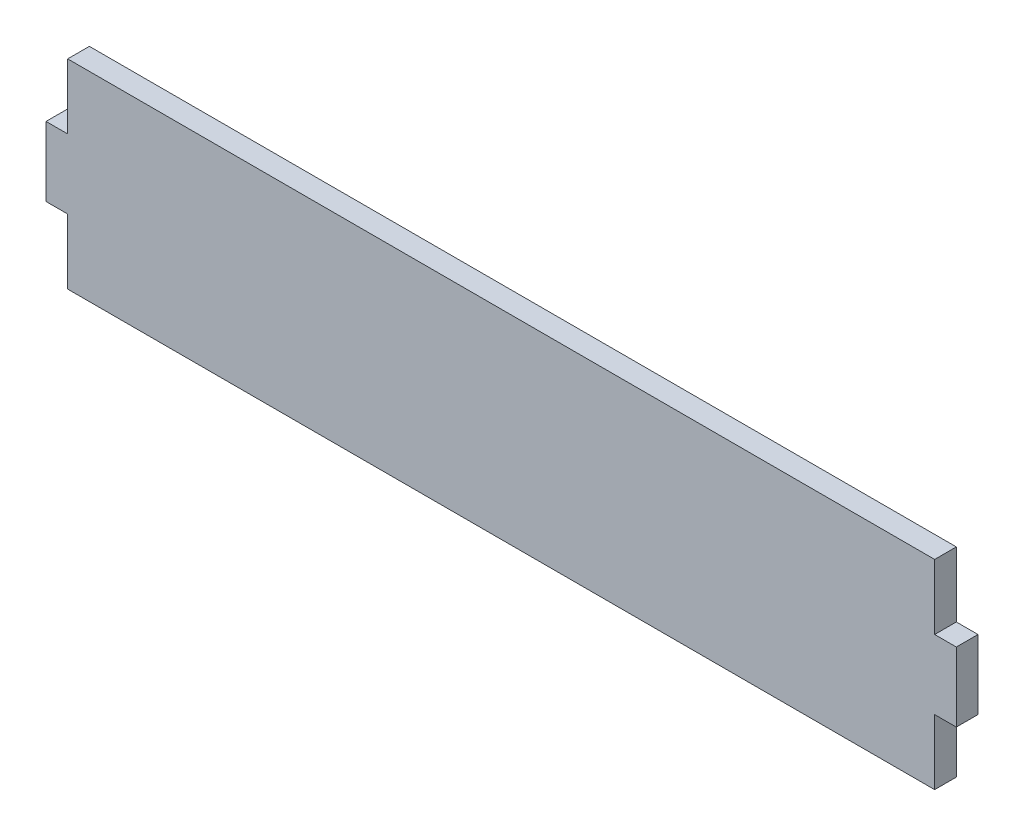
ISO-10303-21;
HEADER;
FILE_DESCRIPTION(('STEP AP214'),'2;1');
FILE_NAME('part.step','',(''),(''),'','','');
FILE_SCHEMA(('AUTOMOTIVE_DESIGN { 1 0 10303 214 1 1 1 1 }'));
ENDSEC;
DATA;
#1=APPLICATION_CONTEXT('core data for automotive mechanical design processes');
#2=APPLICATION_PROTOCOL_DEFINITION('international standard','automotive_design',2000,#1);
#3=PRODUCT_CONTEXT('',#1,'mechanical');
#4=PRODUCT('Part','Part','',(#3));
#5=PRODUCT_RELATED_PRODUCT_CATEGORY('part','',(#4));
#6=PRODUCT_DEFINITION_FORMATION('','',#4);
#7=PRODUCT_DEFINITION_CONTEXT('part definition',#1,'design');
#8=PRODUCT_DEFINITION('design','',#6,#7);
#9=PRODUCT_DEFINITION_SHAPE('','',#8);
#10=(LENGTH_UNIT() NAMED_UNIT(*) SI_UNIT(.MILLI.,.METRE.));
#11=(NAMED_UNIT(*) PLANE_ANGLE_UNIT() SI_UNIT($,.RADIAN.));
#12=(NAMED_UNIT(*) SI_UNIT($,.STERADIAN.) SOLID_ANGLE_UNIT());
#13=UNCERTAINTY_MEASURE_WITH_UNIT(LENGTH_MEASURE(1.E-05),#10,'distance_accuracy_value','');
#14=(GEOMETRIC_REPRESENTATION_CONTEXT(3) GLOBAL_UNCERTAINTY_ASSIGNED_CONTEXT((#13)) GLOBAL_UNIT_ASSIGNED_CONTEXT((#10,
#11,#12)) REPRESENTATION_CONTEXT('',''));
#15=CARTESIAN_POINT('',(0.,0.,0.));
#16=DIRECTION('',(0.,0.,1.));
#17=DIRECTION('',(1.,0.,0.));
#18=AXIS2_PLACEMENT_3D('',#15,#16,#17);
#19=CARTESIAN_POINT('',(52.5,-4.,2.5));
#20=DIRECTION('',(-1.,0.,0.));
#21=DIRECTION('',(0.,0.,1.));
#22=AXIS2_PLACEMENT_3D('',#19,#20,#21);
#23=PLANE('',#22);
#24=DIRECTION('',(0.,1.,0.));
#25=VECTOR('',#24,1.);
#26=CARTESIAN_POINT('',(52.5,-4.,0.));
#27=LINE('',#26,#25);
#28=CARTESIAN_POINT('',(52.5,-4.,0.));
#29=VERTEX_POINT('',#28);
#30=CARTESIAN_POINT('',(52.5,4.,0.));
#31=VERTEX_POINT('',#30);
#32=EDGE_CURVE('E155',#29,#31,#27,.T.);
#33=ORIENTED_EDGE('',*,*,#32,.T.);
#34=DIRECTION('',(0.,0.,-1.));
#35=VECTOR('',#34,1.);
#36=CARTESIAN_POINT('',(52.5,4.,2.5));
#37=LINE('',#36,#35);
#38=CARTESIAN_POINT('',(52.5,4.,2.5));
#39=VERTEX_POINT('',#38);
#40=EDGE_CURVE('E11',#39,#31,#37,.T.);
#41=ORIENTED_EDGE('',*,*,#40,.F.);
#42=DIRECTION('',(0.,1.,0.));
#43=VECTOR('',#42,1.);
#44=CARTESIAN_POINT('',(52.5,-4.,2.5));
#45=LINE('',#44,#43);
#46=CARTESIAN_POINT('',(52.5,-4.,2.5));
#47=VERTEX_POINT('',#46);
#48=EDGE_CURVE('E177',#47,#39,#45,.T.);
#49=ORIENTED_EDGE('',*,*,#48,.F.);
#50=DIRECTION('',(0.,0.,-1.));
#51=VECTOR('',#50,1.);
#52=CARTESIAN_POINT('',(52.5,-4.,2.5));
#53=LINE('',#52,#51);
#54=EDGE_CURVE('E151',#47,#29,#53,.T.);
#55=ORIENTED_EDGE('',*,*,#54,.T.);
#56=EDGE_LOOP('',(#33,#41,#49,#55));
#57=FACE_BOUND('',#56,.T.);
#58=ADVANCED_FACE('F35',(#57),#23,.F.);
#59=CARTESIAN_POINT('',(50.,4.,2.5));
#60=DIRECTION('',(0.,-1.,0.));
#61=DIRECTION('',(0.,0.,-1.));
#62=AXIS2_PLACEMENT_3D('',#59,#60,#61);
#63=PLANE('',#62);
#64=DIRECTION('',(-1.,0.,0.));
#65=VECTOR('',#64,1.);
#66=CARTESIAN_POINT('',(50.,4.,0.));
#67=LINE('',#66,#65);
#68=CARTESIAN_POINT('',(50.,4.,0.));
#69=VERTEX_POINT('',#68);
#70=EDGE_CURVE('E158',#31,#69,#67,.T.);
#71=ORIENTED_EDGE('',*,*,#70,.T.);
#72=DIRECTION('',(0.,0.,-1.));
#73=VECTOR('',#72,1.);
#74=CARTESIAN_POINT('',(50.,4.,2.5));
#75=LINE('',#74,#73);
#76=CARTESIAN_POINT('',(50.,4.,2.5));
#77=VERTEX_POINT('',#76);
#78=EDGE_CURVE('E43',#77,#69,#75,.T.);
#79=ORIENTED_EDGE('',*,*,#78,.F.);
#80=DIRECTION('',(-1.,0.,0.));
#81=VECTOR('',#80,1.);
#82=CARTESIAN_POINT('',(50.,4.,2.5));
#83=LINE('',#82,#81);
#84=EDGE_CURVE('E106',#39,#77,#83,.T.);
#85=ORIENTED_EDGE('',*,*,#84,.F.);
#86=ORIENTED_EDGE('',*,*,#40,.T.);
#87=EDGE_LOOP('',(#71,#79,#85,#86));
#88=FACE_BOUND('',#87,.T.);
#89=ADVANCED_FACE('F255',(#88),#63,.F.);
#90=CARTESIAN_POINT('',(50.,11.5,2.5));
#91=DIRECTION('',(-1.,0.,0.));
#92=DIRECTION('',(0.,0.,1.));
#93=AXIS2_PLACEMENT_3D('',#90,#91,#92);
#94=PLANE('',#93);
#95=DIRECTION('',(0.,1.,0.));
#96=VECTOR('',#95,1.);
#97=CARTESIAN_POINT('',(50.,11.5,0.));
#98=LINE('',#97,#96);
#99=CARTESIAN_POINT('',(50.,11.5,0.));
#100=VERTEX_POINT('',#99);
#101=EDGE_CURVE('E160',#69,#100,#98,.T.);
#102=ORIENTED_EDGE('',*,*,#101,.T.);
#103=DIRECTION('',(0.,0.,-1.));
#104=VECTOR('',#103,1.);
#105=CARTESIAN_POINT('',(50.,11.5,2.5));
#106=LINE('',#105,#104);
#107=CARTESIAN_POINT('',(50.,11.5,2.5));
#108=VERTEX_POINT('',#107);
#109=EDGE_CURVE('E196',#108,#100,#106,.T.);
#110=ORIENTED_EDGE('',*,*,#109,.F.);
#111=DIRECTION('',(0.,1.,0.));
#112=VECTOR('',#111,1.);
#113=CARTESIAN_POINT('',(50.,11.5,2.5));
#114=LINE('',#113,#112);
#115=EDGE_CURVE('E204',#77,#108,#114,.T.);
#116=ORIENTED_EDGE('',*,*,#115,.F.);
#117=ORIENTED_EDGE('',*,*,#78,.T.);
#118=EDGE_LOOP('',(#102,#110,#116,#117));
#119=FACE_BOUND('',#118,.T.);
#120=ADVANCED_FACE('F202',(#119),#94,.F.);
#121=CARTESIAN_POINT('',(-50.,11.5,2.5));
#122=DIRECTION('',(0.,-1.,0.));
#123=DIRECTION('',(1.,0.,0.));
#124=AXIS2_PLACEMENT_3D('',#121,#122,#123);
#125=PLANE('',#124);
#126=DIRECTION('',(-1.,0.,0.));
#127=VECTOR('',#126,1.);
#128=CARTESIAN_POINT('',(-50.,11.5,0.));
#129=LINE('',#128,#127);
#130=CARTESIAN_POINT('',(-50.,11.5,0.));
#131=VERTEX_POINT('',#130);
#132=EDGE_CURVE('E162',#100,#131,#129,.T.);
#133=ORIENTED_EDGE('',*,*,#132,.T.);
#134=DIRECTION('',(0.,0.,-1.));
#135=VECTOR('',#134,1.);
#136=CARTESIAN_POINT('',(-50.,11.5,2.5));
#137=LINE('',#136,#135);
#138=CARTESIAN_POINT('',(-50.,11.5,2.5));
#139=VERTEX_POINT('',#138);
#140=EDGE_CURVE('E193',#139,#131,#137,.T.);
#141=ORIENTED_EDGE('',*,*,#140,.F.);
#142=DIRECTION('',(-1.,0.,0.));
#143=VECTOR('',#142,1.);
#144=CARTESIAN_POINT('',(-50.,11.5,2.5));
#145=LINE('',#144,#143);
#146=EDGE_CURVE('E222',#108,#139,#145,.T.);
#147=ORIENTED_EDGE('',*,*,#146,.F.);
#148=ORIENTED_EDGE('',*,*,#109,.T.);
#149=EDGE_LOOP('',(#133,#141,#147,#148));
#150=FACE_BOUND('',#149,.T.);
#151=ADVANCED_FACE('F213',(#150),#125,.F.);
#152=CARTESIAN_POINT('',(-50.,4.,2.5));
#153=DIRECTION('',(1.,0.,0.));
#154=DIRECTION('',(0.,0.,-1.));
#155=AXIS2_PLACEMENT_3D('',#152,#153,#154);
#156=PLANE('',#155);
#157=DIRECTION('',(0.,-1.,0.));
#158=VECTOR('',#157,1.);
#159=CARTESIAN_POINT('',(-50.,4.,0.));
#160=LINE('',#159,#158);
#161=CARTESIAN_POINT('',(-50.,4.,0.));
#162=VERTEX_POINT('',#161);
#163=EDGE_CURVE('E164',#131,#162,#160,.T.);
#164=ORIENTED_EDGE('',*,*,#163,.T.);
#165=DIRECTION('',(0.,0.,-1.));
#166=VECTOR('',#165,1.);
#167=CARTESIAN_POINT('',(-50.,4.,2.5));
#168=LINE('',#167,#166);
#169=CARTESIAN_POINT('',(-50.,4.,2.5));
#170=VERTEX_POINT('',#169);
#171=EDGE_CURVE('E190',#170,#162,#168,.T.);
#172=ORIENTED_EDGE('',*,*,#171,.F.);
#173=DIRECTION('',(0.,-1.,0.));
#174=VECTOR('',#173,1.);
#175=CARTESIAN_POINT('',(-50.,4.,2.5));
#176=LINE('',#175,#174);
#177=EDGE_CURVE('E219',#139,#170,#176,.T.);
#178=ORIENTED_EDGE('',*,*,#177,.F.);
#179=ORIENTED_EDGE('',*,*,#140,.T.);
#180=EDGE_LOOP('',(#164,#172,#178,#179));
#181=FACE_BOUND('',#180,.T.);
#182=ADVANCED_FACE('F217',(#181),#156,.F.);
#183=CARTESIAN_POINT('',(-50.,4.,2.5));
#184=DIRECTION('',(0.,-1.,0.));
#185=DIRECTION('',(0.,0.,-1.));
#186=AXIS2_PLACEMENT_3D('',#183,#184,#185);
#187=PLANE('',#186);
#188=DIRECTION('',(-1.,0.,0.));
#189=VECTOR('',#188,1.);
#190=CARTESIAN_POINT('',(-50.,4.,0.));
#191=LINE('',#190,#189);
#192=CARTESIAN_POINT('',(-52.5,4.,0.));
#193=VERTEX_POINT('',#192);
#194=EDGE_CURVE('E166',#162,#193,#191,.T.);
#195=ORIENTED_EDGE('',*,*,#194,.T.);
#196=DIRECTION('',(0.,0.,-1.));
#197=VECTOR('',#196,1.);
#198=CARTESIAN_POINT('',(-52.5,4.,2.5));
#199=LINE('',#198,#197);
#200=CARTESIAN_POINT('',(-52.5,4.,2.5));
#201=VERTEX_POINT('',#200);
#202=EDGE_CURVE('E187',#201,#193,#199,.T.);
#203=ORIENTED_EDGE('',*,*,#202,.F.);
#204=DIRECTION('',(-1.,0.,0.));
#205=VECTOR('',#204,1.);
#206=CARTESIAN_POINT('',(-50.,4.,2.5));
#207=LINE('',#206,#205);
#208=EDGE_CURVE('E221',#170,#201,#207,.T.);
#209=ORIENTED_EDGE('',*,*,#208,.F.);
#210=ORIENTED_EDGE('',*,*,#171,.T.);
#211=EDGE_LOOP('',(#195,#203,#209,#210));
#212=FACE_BOUND('',#211,.T.);
#213=ADVANCED_FACE('F268',(#212),#187,.F.);
#214=CARTESIAN_POINT('',(-52.5,-4.,2.5));
#215=DIRECTION('',(1.,0.,0.));
#216=DIRECTION('',(0.,0.,-1.));
#217=AXIS2_PLACEMENT_3D('',#214,#215,#216);
#218=PLANE('',#217);
#219=DIRECTION('',(0.,-1.,0.));
#220=VECTOR('',#219,1.);
#221=CARTESIAN_POINT('',(-52.5,-4.,0.));
#222=LINE('',#221,#220);
#223=CARTESIAN_POINT('',(-52.5,-4.,0.));
#224=VERTEX_POINT('',#223);
#225=EDGE_CURVE('E168',#193,#224,#222,.T.);
#226=ORIENTED_EDGE('',*,*,#225,.T.);
#227=DIRECTION('',(0.,0.,-1.));
#228=VECTOR('',#227,1.);
#229=CARTESIAN_POINT('',(-52.5,-4.,2.5));
#230=LINE('',#229,#228);
#231=CARTESIAN_POINT('',(-52.5,-4.,2.5));
#232=VERTEX_POINT('',#231);
#233=EDGE_CURVE('E184',#232,#224,#230,.T.);
#234=ORIENTED_EDGE('',*,*,#233,.F.);
#235=DIRECTION('',(0.,-1.,0.));
#236=VECTOR('',#235,1.);
#237=CARTESIAN_POINT('',(-52.5,-4.,2.5));
#238=LINE('',#237,#236);
#239=EDGE_CURVE('E224',#201,#232,#238,.T.);
#240=ORIENTED_EDGE('',*,*,#239,.F.);
#241=ORIENTED_EDGE('',*,*,#202,.T.);
#242=EDGE_LOOP('',(#226,#234,#240,#241));
#243=FACE_BOUND('',#242,.T.);
#244=ADVANCED_FACE('F271',(#243),#218,.F.);
#245=CARTESIAN_POINT('',(-50.,-4.,2.5));
#246=DIRECTION('',(0.,1.,0.));
#247=DIRECTION('',(0.,0.,1.));
#248=AXIS2_PLACEMENT_3D('',#245,#246,#247);
#249=PLANE('',#248);
#250=DIRECTION('',(1.,0.,0.));
#251=VECTOR('',#250,1.);
#252=CARTESIAN_POINT('',(-50.,-4.,0.));
#253=LINE('',#252,#251);
#254=CARTESIAN_POINT('',(-50.,-4.,0.));
#255=VERTEX_POINT('',#254);
#256=EDGE_CURVE('E170',#224,#255,#253,.T.);
#257=ORIENTED_EDGE('',*,*,#256,.T.);
#258=DIRECTION('',(0.,0.,-1.));
#259=VECTOR('',#258,1.);
#260=CARTESIAN_POINT('',(-50.,-4.,2.5));
#261=LINE('',#260,#259);
#262=CARTESIAN_POINT('',(-50.,-4.,2.5));
#263=VERTEX_POINT('',#262);
#264=EDGE_CURVE('E181',#263,#255,#261,.T.);
#265=ORIENTED_EDGE('',*,*,#264,.F.);
#266=DIRECTION('',(1.,0.,0.));
#267=VECTOR('',#266,1.);
#268=CARTESIAN_POINT('',(-50.,-4.,2.5));
#269=LINE('',#268,#267);
#270=EDGE_CURVE('E230',#232,#263,#269,.T.);
#271=ORIENTED_EDGE('',*,*,#270,.F.);
#272=ORIENTED_EDGE('',*,*,#233,.T.);
#273=EDGE_LOOP('',(#257,#265,#271,#272));
#274=FACE_BOUND('',#273,.T.);
#275=ADVANCED_FACE('F236',(#274),#249,.F.);
#276=CARTESIAN_POINT('',(-50.,-11.5,2.5));
#277=DIRECTION('',(1.,0.,0.));
#278=DIRECTION('',(0.,0.,-1.));
#279=AXIS2_PLACEMENT_3D('',#276,#277,#278);
#280=PLANE('',#279);
#281=DIRECTION('',(0.,-1.,0.));
#282=VECTOR('',#281,1.);
#283=CARTESIAN_POINT('',(-50.,-11.5,0.));
#284=LINE('',#283,#282);
#285=CARTESIAN_POINT('',(-50.,-11.5,0.));
#286=VERTEX_POINT('',#285);
#287=EDGE_CURVE('E172',#255,#286,#284,.T.);
#288=ORIENTED_EDGE('',*,*,#287,.T.);
#289=DIRECTION('',(0.,0.,-1.));
#290=VECTOR('',#289,1.);
#291=CARTESIAN_POINT('',(-50.,-11.5,2.5));
#292=LINE('',#291,#290);
#293=CARTESIAN_POINT('',(-50.,-11.5,2.5));
#294=VERTEX_POINT('',#293);
#295=EDGE_CURVE('E146',#294,#286,#292,.T.);
#296=ORIENTED_EDGE('',*,*,#295,.F.);
#297=DIRECTION('',(0.,-1.,0.));
#298=VECTOR('',#297,1.);
#299=CARTESIAN_POINT('',(-50.,-11.5,2.5));
#300=LINE('',#299,#298);
#301=EDGE_CURVE('E137',#263,#294,#300,.T.);
#302=ORIENTED_EDGE('',*,*,#301,.F.);
#303=ORIENTED_EDGE('',*,*,#264,.T.);
#304=EDGE_LOOP('',(#288,#296,#302,#303));
#305=FACE_BOUND('',#304,.T.);
#306=ADVANCED_FACE('F240',(#305),#280,.F.);
#307=CARTESIAN_POINT('',(50.,-11.5,2.5));
#308=DIRECTION('',(0.,1.,0.));
#309=DIRECTION('',(-1.,0.,0.));
#310=AXIS2_PLACEMENT_3D('',#307,#308,#309);
#311=PLANE('',#310);
#312=DIRECTION('',(1.,0.,0.));
#313=VECTOR('',#312,1.);
#314=CARTESIAN_POINT('',(50.,-11.5,0.));
#315=LINE('',#314,#313);
#316=CARTESIAN_POINT('',(50.,-11.5,0.));
#317=VERTEX_POINT('',#316);
#318=EDGE_CURVE('E145',#286,#317,#315,.T.);
#319=ORIENTED_EDGE('',*,*,#318,.T.);
#320=DIRECTION('',(0.,0.,-1.));
#321=VECTOR('',#320,1.);
#322=CARTESIAN_POINT('',(50.,-11.5,2.5));
#323=LINE('',#322,#321);
#324=CARTESIAN_POINT('',(50.,-11.5,2.5));
#325=VERTEX_POINT('',#324);
#326=EDGE_CURVE('E142',#325,#317,#323,.T.);
#327=ORIENTED_EDGE('',*,*,#326,.F.);
#328=DIRECTION('',(1.,0.,0.));
#329=VECTOR('',#328,1.);
#330=CARTESIAN_POINT('',(50.,-11.5,2.5));
#331=LINE('',#330,#329);
#332=EDGE_CURVE('E131',#294,#325,#331,.T.);
#333=ORIENTED_EDGE('',*,*,#332,.F.);
#334=ORIENTED_EDGE('',*,*,#295,.T.);
#335=EDGE_LOOP('',(#319,#327,#333,#334));
#336=FACE_BOUND('',#335,.T.);
#337=ADVANCED_FACE('F143',(#336),#311,.F.);
#338=CARTESIAN_POINT('',(50.,-4.,2.5));
#339=DIRECTION('',(-1.,0.,0.));
#340=DIRECTION('',(0.,0.,1.));
#341=AXIS2_PLACEMENT_3D('',#338,#339,#340);
#342=PLANE('',#341);
#343=DIRECTION('',(0.,1.,0.));
#344=VECTOR('',#343,1.);
#345=CARTESIAN_POINT('',(50.,-4.,0.));
#346=LINE('',#345,#344);
#347=CARTESIAN_POINT('',(50.,-4.,0.));
#348=VERTEX_POINT('',#347);
#349=EDGE_CURVE('E92',#317,#348,#346,.T.);
#350=ORIENTED_EDGE('',*,*,#349,.T.);
#351=DIRECTION('',(0.,0.,-1.));
#352=VECTOR('',#351,1.);
#353=CARTESIAN_POINT('',(50.,-4.,2.5));
#354=LINE('',#353,#352);
#355=CARTESIAN_POINT('',(50.,-4.,2.5));
#356=VERTEX_POINT('',#355);
#357=EDGE_CURVE('E147',#356,#348,#354,.T.);
#358=ORIENTED_EDGE('',*,*,#357,.F.);
#359=DIRECTION('',(0.,1.,0.));
#360=VECTOR('',#359,1.);
#361=CARTESIAN_POINT('',(50.,-4.,2.5));
#362=LINE('',#361,#360);
#363=EDGE_CURVE('E135',#325,#356,#362,.T.);
#364=ORIENTED_EDGE('',*,*,#363,.F.);
#365=ORIENTED_EDGE('',*,*,#326,.T.);
#366=EDGE_LOOP('',(#350,#358,#364,#365));
#367=FACE_BOUND('',#366,.T.);
#368=ADVANCED_FACE('F149',(#367),#342,.F.);
#369=CARTESIAN_POINT('',(50.,-4.,2.5));
#370=DIRECTION('',(0.,1.,0.));
#371=DIRECTION('',(0.,0.,1.));
#372=AXIS2_PLACEMENT_3D('',#369,#370,#371);
#373=PLANE('',#372);
#374=DIRECTION('',(1.,0.,0.));
#375=VECTOR('',#374,1.);
#376=CARTESIAN_POINT('',(50.,-4.,0.));
#377=LINE('',#376,#375);
#378=EDGE_CURVE('E98',#348,#29,#377,.T.);
#379=ORIENTED_EDGE('',*,*,#378,.T.);
#380=ORIENTED_EDGE('',*,*,#54,.F.);
#381=DIRECTION('',(1.,0.,0.));
#382=VECTOR('',#381,1.);
#383=CARTESIAN_POINT('',(50.,-4.,2.5));
#384=LINE('',#383,#382);
#385=EDGE_CURVE('E51',#356,#47,#384,.T.);
#386=ORIENTED_EDGE('',*,*,#385,.F.);
#387=ORIENTED_EDGE('',*,*,#357,.T.);
#388=EDGE_LOOP('',(#379,#380,#386,#387));
#389=FACE_BOUND('',#388,.T.);
#390=ADVANCED_FACE('F244',(#389),#373,.F.);
#391=CARTESIAN_POINT('',(0.,0.,2.5));
#392=DIRECTION('',(0.,0.,-1.));
#393=DIRECTION('',(-1.,0.,0.));
#394=AXIS2_PLACEMENT_3D('',#391,#392,#393);
#395=PLANE('',#394);
#396=ORIENTED_EDGE('',*,*,#48,.T.);
#397=ORIENTED_EDGE('',*,*,#84,.T.);
#398=ORIENTED_EDGE('',*,*,#115,.T.);
#399=ORIENTED_EDGE('',*,*,#146,.T.);
#400=ORIENTED_EDGE('',*,*,#177,.T.);
#401=ORIENTED_EDGE('',*,*,#208,.T.);
#402=ORIENTED_EDGE('',*,*,#239,.T.);
#403=ORIENTED_EDGE('',*,*,#270,.T.);
#404=ORIENTED_EDGE('',*,*,#301,.T.);
#405=ORIENTED_EDGE('',*,*,#332,.T.);
#406=ORIENTED_EDGE('',*,*,#363,.T.);
#407=ORIENTED_EDGE('',*,*,#385,.T.);
#408=EDGE_LOOP('',(#396,#397,#398,#399,#400,#401,#402,#403,#404,#405,#406,#407));
#409=FACE_BOUND('',#408,.T.);
#410=ADVANCED_FACE('F133',(#409),#395,.F.);
#411=CARTESIAN_POINT('',(0.,0.,0.));
#412=DIRECTION('',(0.,0.,-1.));
#413=DIRECTION('',(-1.,0.,0.));
#414=AXIS2_PLACEMENT_3D('',#411,#412,#413);
#415=PLANE('',#414);
#416=ORIENTED_EDGE('',*,*,#32,.F.);
#417=ORIENTED_EDGE('',*,*,#378,.F.);
#418=ORIENTED_EDGE('',*,*,#349,.F.);
#419=ORIENTED_EDGE('',*,*,#318,.F.);
#420=ORIENTED_EDGE('',*,*,#287,.F.);
#421=ORIENTED_EDGE('',*,*,#256,.F.);
#422=ORIENTED_EDGE('',*,*,#225,.F.);
#423=ORIENTED_EDGE('',*,*,#194,.F.);
#424=ORIENTED_EDGE('',*,*,#163,.F.);
#425=ORIENTED_EDGE('',*,*,#132,.F.);
#426=ORIENTED_EDGE('',*,*,#101,.F.);
#427=ORIENTED_EDGE('',*,*,#70,.F.);
#428=EDGE_LOOP('',(#416,#417,#418,#419,#420,#421,#422,#423,#424,#425,#426,#427));
#429=FACE_BOUND('',#428,.T.);
#430=ADVANCED_FACE('F208',(#429),#415,.T.);
#431=CLOSED_SHELL('',(#58,#89,#120,#151,#182,#213,#244,#275,#306,#337,#368,#390,#410,#430));
#432=MANIFOLD_SOLID_BREP('B2',#431);
#433=ADVANCED_BREP_SHAPE_REPRESENTATION('',(#18,#432),#14);
#434=SHAPE_DEFINITION_REPRESENTATION(#9,#433);
ENDSEC;
END-ISO-10303-21;
